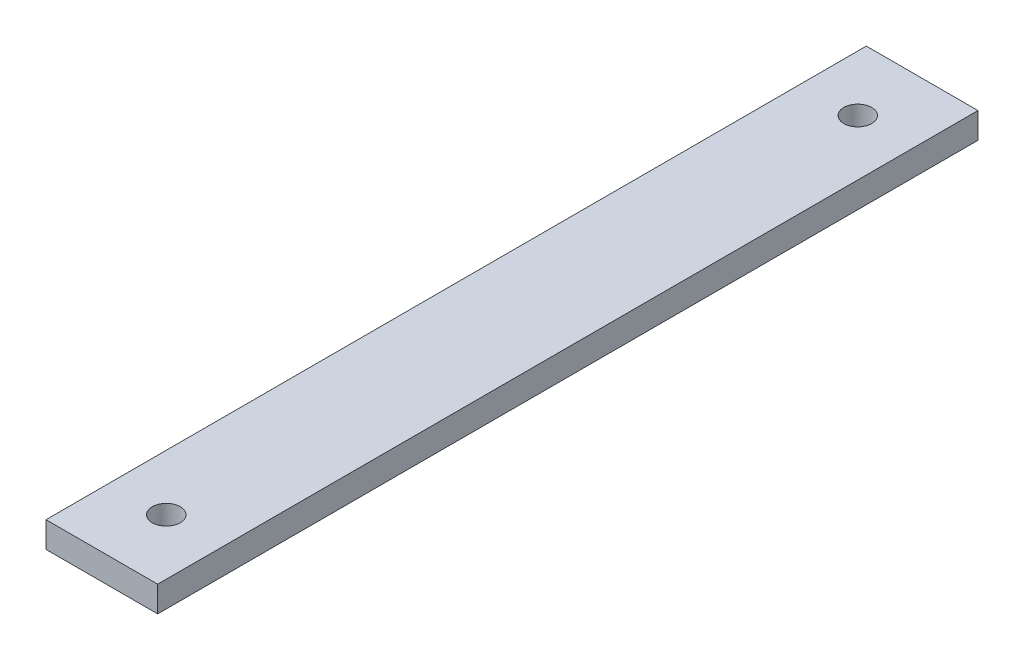
ISO-10303-21;
HEADER;
FILE_DESCRIPTION(('STEP AP214'),'2;1');
FILE_NAME('part.step','',(''),(''),'','','');
FILE_SCHEMA(('AUTOMOTIVE_DESIGN { 1 0 10303 214 1 1 1 1 }'));
ENDSEC;
DATA;
#1=APPLICATION_CONTEXT('core data for automotive mechanical design processes');
#2=APPLICATION_PROTOCOL_DEFINITION('international standard','automotive_design',2000,#1);
#3=PRODUCT_CONTEXT('',#1,'mechanical');
#4=PRODUCT('Part','Part','',(#3));
#5=PRODUCT_RELATED_PRODUCT_CATEGORY('part','',(#4));
#6=PRODUCT_DEFINITION_FORMATION('','',#4);
#7=PRODUCT_DEFINITION_CONTEXT('part definition',#1,'design');
#8=PRODUCT_DEFINITION('design','',#6,#7);
#9=PRODUCT_DEFINITION_SHAPE('','',#8);
#10=(LENGTH_UNIT() NAMED_UNIT(*) SI_UNIT(.MILLI.,.METRE.));
#11=(NAMED_UNIT(*) PLANE_ANGLE_UNIT() SI_UNIT($,.RADIAN.));
#12=(NAMED_UNIT(*) SI_UNIT($,.STERADIAN.) SOLID_ANGLE_UNIT());
#13=UNCERTAINTY_MEASURE_WITH_UNIT(LENGTH_MEASURE(1.E-05),#10,'distance_accuracy_value','');
#14=(GEOMETRIC_REPRESENTATION_CONTEXT(3) GLOBAL_UNCERTAINTY_ASSIGNED_CONTEXT((#13)) GLOBAL_UNIT_ASSIGNED_CONTEXT((#10,
#11,#12)) REPRESENTATION_CONTEXT('',''));
#15=CARTESIAN_POINT('',(0.,0.,0.));
#16=DIRECTION('',(0.,0.,1.));
#17=DIRECTION('',(1.,0.,0.));
#18=AXIS2_PLACEMENT_3D('',#15,#16,#17);
#19=CARTESIAN_POINT('',(-76.2365276513646,6.,-44.4548712542977));
#20=DIRECTION('',(1.,0.,0.));
#21=DIRECTION('',(0.,0.,-1.));
#22=AXIS2_PLACEMENT_3D('',#19,#20,#21);
#23=PLANE('',#22);
#24=DIRECTION('',(0.,0.,1.));
#25=VECTOR('',#24,1.);
#26=CARTESIAN_POINT('',(-76.2365276513646,0.,-44.4548712542977));
#27=LINE('',#26,#25);
#28=CARTESIAN_POINT('',(-76.2365276513646,0.,-44.4548712542977));
#29=VERTEX_POINT('',#28);
#30=CARTESIAN_POINT('',(-76.2365276513646,0.,146.545128745702));
#31=VERTEX_POINT('',#30);
#32=EDGE_CURVE('E96',#29,#31,#27,.T.);
#33=ORIENTED_EDGE('',*,*,#32,.T.);
#34=DIRECTION('',(0.,-1.,0.));
#35=VECTOR('',#34,1.);
#36=CARTESIAN_POINT('',(-76.2365276513646,6.,146.545128745702));
#37=LINE('',#36,#35);
#38=CARTESIAN_POINT('',(-76.2365276513646,6.,146.545128745702));
#39=VERTEX_POINT('',#38);
#40=EDGE_CURVE('E11',#39,#31,#37,.T.);
#41=ORIENTED_EDGE('',*,*,#40,.F.);
#42=DIRECTION('',(0.,0.,1.));
#43=VECTOR('',#42,1.);
#44=CARTESIAN_POINT('',(-76.2365276513646,6.,-44.4548712542977));
#45=LINE('',#44,#43);
#46=CARTESIAN_POINT('',(-76.2365276513646,6.,-44.4548712542977));
#47=VERTEX_POINT('',#46);
#48=EDGE_CURVE('E84',#47,#39,#45,.T.);
#49=ORIENTED_EDGE('',*,*,#48,.F.);
#50=DIRECTION('',(0.,-1.,0.));
#51=VECTOR('',#50,1.);
#52=CARTESIAN_POINT('',(-76.2365276513646,6.,-44.4548712542977));
#53=LINE('',#52,#51);
#54=EDGE_CURVE('E92',#47,#29,#53,.T.);
#55=ORIENTED_EDGE('',*,*,#54,.T.);
#56=EDGE_LOOP('',(#33,#41,#49,#55));
#57=FACE_BOUND('',#56,.T.);
#58=ADVANCED_FACE('F33',(#57),#23,.F.);
#59=CARTESIAN_POINT('',(-76.2365276513646,6.,146.545128745702));
#60=DIRECTION('',(0.,0.,-1.));
#61=DIRECTION('',(-1.,0.,0.));
#62=AXIS2_PLACEMENT_3D('',#59,#60,#61);
#63=PLANE('',#62);
#64=DIRECTION('',(1.,0.,0.));
#65=VECTOR('',#64,1.);
#66=CARTESIAN_POINT('',(-76.2365276513646,0.,146.545128745702));
#67=LINE('',#66,#65);
#68=CARTESIAN_POINT('',(-50.2365276513646,0.,146.545128745702));
#69=VERTEX_POINT('',#68);
#70=EDGE_CURVE('E88',#31,#69,#67,.T.);
#71=ORIENTED_EDGE('',*,*,#70,.T.);
#72=DIRECTION('',(0.,-1.,0.));
#73=VECTOR('',#72,1.);
#74=CARTESIAN_POINT('',(-50.2365276513646,6.,146.545128745702));
#75=LINE('',#74,#73);
#76=CARTESIAN_POINT('',(-50.2365276513646,6.,146.545128745702));
#77=VERTEX_POINT('',#76);
#78=EDGE_CURVE('E41',#77,#69,#75,.T.);
#79=ORIENTED_EDGE('',*,*,#78,.F.);
#80=DIRECTION('',(1.,0.,0.));
#81=VECTOR('',#80,1.);
#82=CARTESIAN_POINT('',(-76.2365276513646,6.,146.545128745702));
#83=LINE('',#82,#81);
#84=EDGE_CURVE('E79',#39,#77,#83,.T.);
#85=ORIENTED_EDGE('',*,*,#84,.F.);
#86=ORIENTED_EDGE('',*,*,#40,.T.);
#87=EDGE_LOOP('',(#71,#79,#85,#86));
#88=FACE_BOUND('',#87,.T.);
#89=ADVANCED_FACE('F87',(#88),#63,.F.);
#90=CARTESIAN_POINT('',(-50.2365276513646,6.,-44.4548712542977));
#91=DIRECTION('',(-1.,0.,0.));
#92=DIRECTION('',(0.,0.,1.));
#93=AXIS2_PLACEMENT_3D('',#90,#91,#92);
#94=PLANE('',#93);
#95=DIRECTION('',(0.,0.,-1.));
#96=VECTOR('',#95,1.);
#97=CARTESIAN_POINT('',(-50.2365276513646,0.,-44.4548712542977));
#98=LINE('',#97,#96);
#99=CARTESIAN_POINT('',(-50.2365276513646,0.,-44.4548712542977));
#100=VERTEX_POINT('',#99);
#101=EDGE_CURVE('E66',#69,#100,#98,.T.);
#102=ORIENTED_EDGE('',*,*,#101,.T.);
#103=DIRECTION('',(0.,-1.,0.));
#104=VECTOR('',#103,1.);
#105=CARTESIAN_POINT('',(-50.2365276513646,6.,-44.4548712542977));
#106=LINE('',#105,#104);
#107=CARTESIAN_POINT('',(-50.2365276513646,6.,-44.4548712542977));
#108=VERTEX_POINT('',#107);
#109=EDGE_CURVE('E89',#108,#100,#106,.T.);
#110=ORIENTED_EDGE('',*,*,#109,.F.);
#111=DIRECTION('',(0.,0.,-1.));
#112=VECTOR('',#111,1.);
#113=CARTESIAN_POINT('',(-50.2365276513646,6.,-44.4548712542977));
#114=LINE('',#113,#112);
#115=EDGE_CURVE('E82',#77,#108,#114,.T.);
#116=ORIENTED_EDGE('',*,*,#115,.F.);
#117=ORIENTED_EDGE('',*,*,#78,.T.);
#118=EDGE_LOOP('',(#102,#110,#116,#117));
#119=FACE_BOUND('',#118,.T.);
#120=ADVANCED_FACE('F90',(#119),#94,.F.);
#121=CARTESIAN_POINT('',(-76.2365276513646,6.,-44.4548712542977));
#122=DIRECTION('',(0.,0.,1.));
#123=DIRECTION('',(1.,0.,0.));
#124=AXIS2_PLACEMENT_3D('',#121,#122,#123);
#125=PLANE('',#124);
#126=DIRECTION('',(-1.,0.,0.));
#127=VECTOR('',#126,1.);
#128=CARTESIAN_POINT('',(-76.2365276513646,0.,-44.4548712542977));
#129=LINE('',#128,#127);
#130=EDGE_CURVE('E72',#100,#29,#129,.T.);
#131=ORIENTED_EDGE('',*,*,#130,.T.);
#132=ORIENTED_EDGE('',*,*,#54,.F.);
#133=DIRECTION('',(-1.,0.,0.));
#134=VECTOR('',#133,1.);
#135=CARTESIAN_POINT('',(-76.2365276513646,6.,-44.4548712542977));
#136=LINE('',#135,#134);
#137=EDGE_CURVE('E49',#108,#47,#136,.T.);
#138=ORIENTED_EDGE('',*,*,#137,.F.);
#139=ORIENTED_EDGE('',*,*,#109,.T.);
#140=EDGE_LOOP('',(#131,#132,#138,#139));
#141=FACE_BOUND('',#140,.T.);
#142=ADVANCED_FACE('F104',(#141),#125,.F.);
#143=CARTESIAN_POINT('',(0.,6.,0.));
#144=DIRECTION('',(0.,1.,0.));
#145=DIRECTION('',(0.,0.,1.));
#146=AXIS2_PLACEMENT_3D('',#143,#144,#145);
#147=PLANE('',#146);
#148=CARTESIAN_POINT('',(-63.2365276513646,6.,131.545128745702));
#149=DIRECTION('',(0.,1.,0.));
#150=DIRECTION('',(0.,0.,1.));
#151=AXIS2_PLACEMENT_3D('',#148,#149,#150);
#152=CIRCLE('',#151,3.25000000000001);
#153=CARTESIAN_POINT('',(-63.2365276513646,6.,134.795128745702));
#154=VERTEX_POINT('',#153);
#155=EDGE_CURVE('E99',#154,#154,#152,.T.);
#156=ORIENTED_EDGE('',*,*,#155,.F.);
#157=EDGE_LOOP('',(#156));
#158=FACE_BOUND('',#157,.T.);
#159=CARTESIAN_POINT('',(-63.2365276513646,6.,-29.4548712542977));
#160=DIRECTION('',(0.,1.,0.));
#161=DIRECTION('',(0.,0.,1.));
#162=AXIS2_PLACEMENT_3D('',#159,#160,#161);
#163=CIRCLE('',#162,3.25000000000001);
#164=CARTESIAN_POINT('',(-63.2365276513646,6.,-26.2048712542977));
#165=VERTEX_POINT('',#164);
#166=EDGE_CURVE('E112',#165,#165,#163,.T.);
#167=ORIENTED_EDGE('',*,*,#166,.F.);
#168=EDGE_LOOP('',(#167));
#169=FACE_BOUND('',#168,.T.);
#170=ORIENTED_EDGE('',*,*,#48,.T.);
#171=ORIENTED_EDGE('',*,*,#84,.T.);
#172=ORIENTED_EDGE('',*,*,#115,.T.);
#173=ORIENTED_EDGE('',*,*,#137,.T.);
#174=EDGE_LOOP('',(#170,#171,#172,#173));
#175=FACE_BOUND('',#174,.T.);
#176=ADVANCED_FACE('F80',(#158,#169,#175),#147,.T.);
#177=CARTESIAN_POINT('',(0.,0.,0.));
#178=DIRECTION('',(0.,1.,0.));
#179=DIRECTION('',(0.,0.,1.));
#180=AXIS2_PLACEMENT_3D('',#177,#178,#179);
#181=PLANE('',#180);
#182=CARTESIAN_POINT('',(-63.2365276513646,0.,131.545128745702));
#183=DIRECTION('',(0.,-1.,0.));
#184=DIRECTION('',(0.,0.,-1.));
#185=AXIS2_PLACEMENT_3D('',#182,#183,#184);
#186=CIRCLE('',#185,3.25000000000001);
#187=CARTESIAN_POINT('',(-63.2365276513646,0.,128.295128745702));
#188=VERTEX_POINT('',#187);
#189=EDGE_CURVE('E115',#188,#188,#186,.T.);
#190=ORIENTED_EDGE('',*,*,#189,.F.);
#191=EDGE_LOOP('',(#190));
#192=FACE_BOUND('',#191,.T.);
#193=CARTESIAN_POINT('',(-63.2365276513646,0.,-29.4548712542977));
#194=DIRECTION('',(0.,-1.,0.));
#195=DIRECTION('',(0.,0.,-1.));
#196=AXIS2_PLACEMENT_3D('',#193,#194,#195);
#197=CIRCLE('',#196,3.25000000000001);
#198=CARTESIAN_POINT('',(-63.2365276513646,0.,-32.7048712542977));
#199=VERTEX_POINT('',#198);
#200=EDGE_CURVE('E116',#199,#199,#197,.T.);
#201=ORIENTED_EDGE('',*,*,#200,.F.);
#202=EDGE_LOOP('',(#201));
#203=FACE_BOUND('',#202,.T.);
#204=ORIENTED_EDGE('',*,*,#32,.F.);
#205=ORIENTED_EDGE('',*,*,#130,.F.);
#206=ORIENTED_EDGE('',*,*,#101,.F.);
#207=ORIENTED_EDGE('',*,*,#70,.F.);
#208=EDGE_LOOP('',(#204,#205,#206,#207));
#209=FACE_BOUND('',#208,.T.);
#210=ADVANCED_FACE('F107',(#192,#203,#209),#181,.F.);
#211=CARTESIAN_POINT('',(-63.2365276513646,10.,-29.4548712542977));
#212=DIRECTION('',(0.,-1.,0.));
#213=DIRECTION('',(0.,0.,-1.));
#214=AXIS2_PLACEMENT_3D('',#211,#212,#213);
#215=CYLINDRICAL_SURFACE('',#214,3.25000000000001);
#216=ORIENTED_EDGE('',*,*,#166,.T.);
#217=EDGE_LOOP('',(#216));
#218=FACE_BOUND('',#217,.T.);
#219=ORIENTED_EDGE('',*,*,#200,.T.);
#220=EDGE_LOOP('',(#219));
#221=FACE_BOUND('',#220,.T.);
#222=ADVANCED_FACE('F126',(#218,#221),#215,.F.);
#223=CARTESIAN_POINT('',(-63.2365276513646,10.,131.545128745702));
#224=DIRECTION('',(0.,-1.,0.));
#225=DIRECTION('',(0.,0.,-1.));
#226=AXIS2_PLACEMENT_3D('',#223,#224,#225);
#227=CYLINDRICAL_SURFACE('',#226,3.25000000000001);
#228=ORIENTED_EDGE('',*,*,#155,.T.);
#229=EDGE_LOOP('',(#228));
#230=FACE_BOUND('',#229,.T.);
#231=ORIENTED_EDGE('',*,*,#189,.T.);
#232=EDGE_LOOP('',(#231));
#233=FACE_BOUND('',#232,.T.);
#234=ADVANCED_FACE('F122',(#230,#233),#227,.F.);
#235=CLOSED_SHELL('',(#58,#89,#120,#142,#176,#210,#222,#234));
#236=MANIFOLD_SOLID_BREP('B2',#235);
#237=ADVANCED_BREP_SHAPE_REPRESENTATION('',(#18,#236),#14);
#238=SHAPE_DEFINITION_REPRESENTATION(#9,#237);
ENDSEC;
END-ISO-10303-21;
